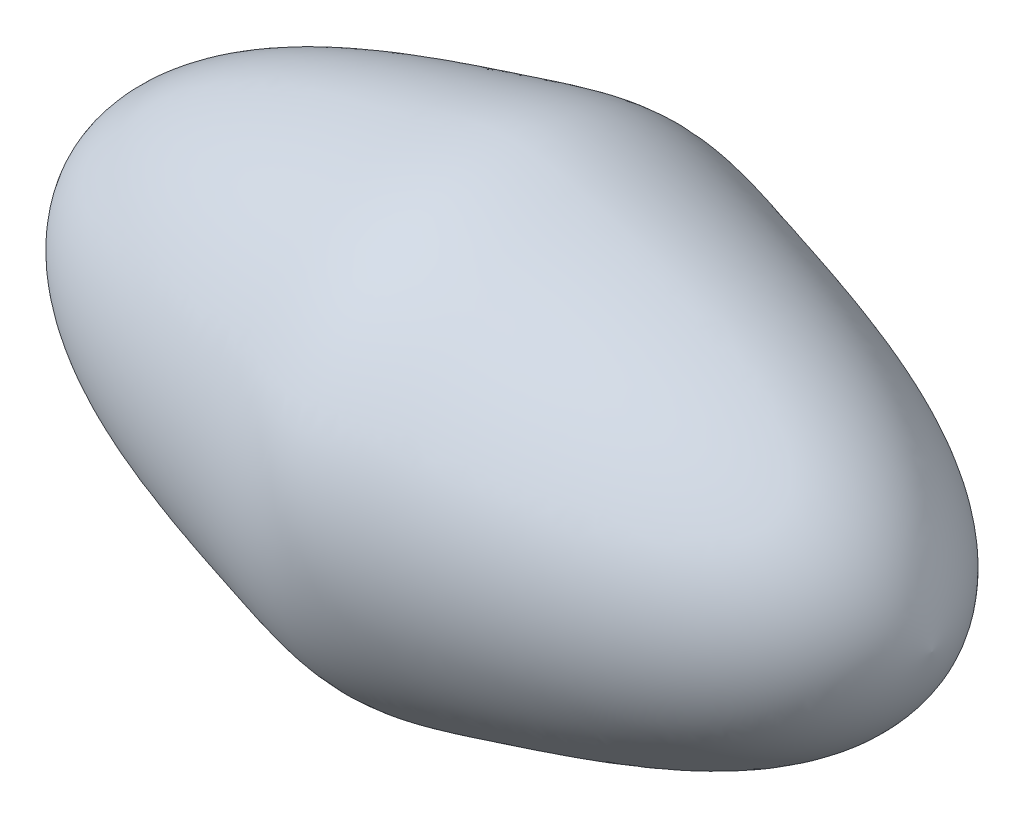
ISO-10303-21;
HEADER;
FILE_DESCRIPTION(('STEP AP214'),'2;1');
FILE_NAME('part.step','',(''),(''),'','','');
FILE_SCHEMA(('AUTOMOTIVE_DESIGN { 1 0 10303 214 1 1 1 1 }'));
ENDSEC;
DATA;
#1=APPLICATION_CONTEXT('core data for automotive mechanical design processes');
#2=APPLICATION_PROTOCOL_DEFINITION('international standard','automotive_design',2000,#1);
#3=PRODUCT_CONTEXT('',#1,'mechanical');
#4=PRODUCT('Part','Part','',(#3));
#5=PRODUCT_RELATED_PRODUCT_CATEGORY('part','',(#4));
#6=PRODUCT_DEFINITION_FORMATION('','',#4);
#7=PRODUCT_DEFINITION_CONTEXT('part definition',#1,'design');
#8=PRODUCT_DEFINITION('design','',#6,#7);
#9=PRODUCT_DEFINITION_SHAPE('','',#8);
#10=(LENGTH_UNIT() NAMED_UNIT(*) SI_UNIT(.MILLI.,.METRE.));
#11=(NAMED_UNIT(*) PLANE_ANGLE_UNIT() SI_UNIT($,.RADIAN.));
#12=(NAMED_UNIT(*) SI_UNIT($,.STERADIAN.) SOLID_ANGLE_UNIT());
#13=UNCERTAINTY_MEASURE_WITH_UNIT(LENGTH_MEASURE(1.E-05),#10,'distance_accuracy_value','');
#14=(GEOMETRIC_REPRESENTATION_CONTEXT(3) GLOBAL_UNCERTAINTY_ASSIGNED_CONTEXT((#13)) GLOBAL_UNIT_ASSIGNED_CONTEXT((#10,
#11,#12)) REPRESENTATION_CONTEXT('',''));
#15=CARTESIAN_POINT('',(0.,0.,0.));
#16=DIRECTION('',(0.,0.,1.));
#17=DIRECTION('',(1.,0.,0.));
#18=AXIS2_PLACEMENT_3D('',#15,#16,#17);
#19=CARTESIAN_POINT('',(0.,0.,0.));
#20=CARTESIAN_POINT('',(0.224699683127372,1.46248712557277,0.));
#21=CARTESIAN_POINT('',(2.47250554203637,2.03521689747228,0.));
#22=CARTESIAN_POINT('',(4.5,2.5881126898262,0.));
#23=CARTESIAN_POINT('',(6.52749445796364,2.03521689747229,0.));
#24=CARTESIAN_POINT('',(8.77530031687263,1.46248712557277,0.));
#25=CARTESIAN_POINT('',(9.,0.,0.));
#26=B_SPLINE_CURVE_WITH_KNOTS('',3,(#19,#20,#21,#22,#23,#24,#25),.UNSPECIFIED.,.F.,.F.,(4,1,1,1,
4),(0.,0.405210958243753,0.5,0.594789041756247,1.),.UNSPECIFIED.);
#27=CARTESIAN_POINT('',(0.,0.,0.));
#28=DIRECTION('',(-1.,0.,0.));
#29=AXIS1_PLACEMENT('',#27,#28);
#30=SURFACE_OF_REVOLUTION('',#26,#29);
#31=CARTESIAN_POINT('',(9.,0.,0.));
#32=VERTEX_POINT('',#31);
#33=VERTEX_LOOP('',#32);
#34=FACE_BOUND('',#33,.T.);
#35=CARTESIAN_POINT('',(0.,0.,0.));
#36=VERTEX_POINT('',#35);
#37=VERTEX_LOOP('',#36);
#38=FACE_BOUND('',#37,.T.);
#39=ADVANCED_FACE('F40',(#34,#38),#30,.F.);
#40=CLOSED_SHELL('',(#39));
#41=MANIFOLD_SOLID_BREP('B2',#40);
#42=ADVANCED_BREP_SHAPE_REPRESENTATION('',(#18,#41),#14);
#43=SHAPE_DEFINITION_REPRESENTATION(#9,#42);
ENDSEC;
END-ISO-10303-21;
